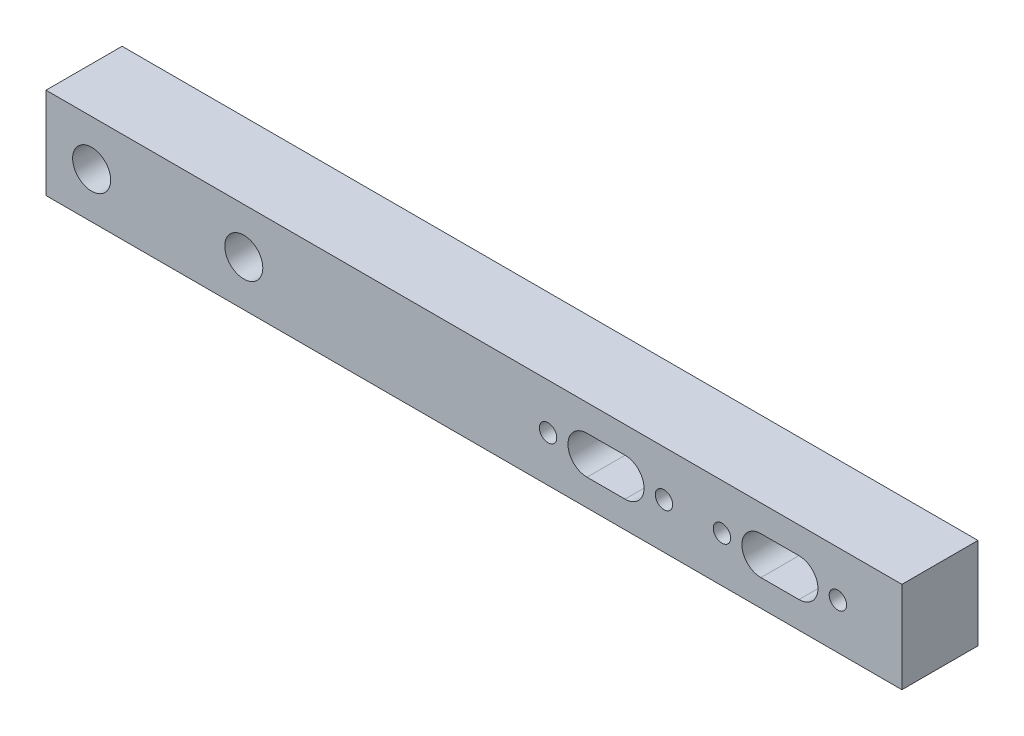
ISO-10303-21;
HEADER;
FILE_DESCRIPTION(('STEP AP214'),'2;1');
FILE_NAME('part.step','',(''),(''),'','','');
FILE_SCHEMA(('AUTOMOTIVE_DESIGN { 1 0 10303 214 1 1 1 1 }'));
ENDSEC;
DATA;
#1=APPLICATION_CONTEXT('core data for automotive mechanical design processes');
#2=APPLICATION_PROTOCOL_DEFINITION('international standard','automotive_design',2000,#1);
#3=PRODUCT_CONTEXT('',#1,'mechanical');
#4=PRODUCT('Part','Part','',(#3));
#5=PRODUCT_RELATED_PRODUCT_CATEGORY('part','',(#4));
#6=PRODUCT_DEFINITION_FORMATION('','',#4);
#7=PRODUCT_DEFINITION_CONTEXT('part definition',#1,'design');
#8=PRODUCT_DEFINITION('design','',#6,#7);
#9=PRODUCT_DEFINITION_SHAPE('','',#8);
#10=(LENGTH_UNIT() NAMED_UNIT(*) SI_UNIT(.MILLI.,.METRE.));
#11=(NAMED_UNIT(*) PLANE_ANGLE_UNIT() SI_UNIT($,.RADIAN.));
#12=(NAMED_UNIT(*) SI_UNIT($,.STERADIAN.) SOLID_ANGLE_UNIT());
#13=UNCERTAINTY_MEASURE_WITH_UNIT(LENGTH_MEASURE(1.E-05),#10,'distance_accuracy_value','');
#14=(GEOMETRIC_REPRESENTATION_CONTEXT(3) GLOBAL_UNCERTAINTY_ASSIGNED_CONTEXT((#13)) GLOBAL_UNIT_ASSIGNED_CONTEXT((#10,
#11,#12)) REPRESENTATION_CONTEXT('',''));
#15=CARTESIAN_POINT('',(0.,0.,0.));
#16=DIRECTION('',(0.,0.,1.));
#17=DIRECTION('',(1.,0.,0.));
#18=AXIS2_PLACEMENT_3D('',#15,#16,#17);
#19=CARTESIAN_POINT('',(0.,0.,10.));
#20=DIRECTION('',(0.,0.,1.));
#21=DIRECTION('',(1.,0.,0.));
#22=AXIS2_PLACEMENT_3D('',#19,#20,#21);
#23=PLANE('',#22);
#24=CARTESIAN_POINT('',(-66.6827911345728,73.1963244597104,10.));
#25=DIRECTION('',(0.,0.,1.));
#26=DIRECTION('',(1.,0.,0.));
#27=AXIS2_PLACEMENT_3D('',#24,#25,#26);
#28=CIRCLE('',#27,1.14299999999999);
#29=CARTESIAN_POINT('',(-65.5397911345728,73.1963244597104,10.));
#30=VERTEX_POINT('',#29);
#31=EDGE_CURVE('E195',#30,#30,#28,.T.);
#32=ORIENTED_EDGE('',*,*,#31,.F.);
#33=EDGE_LOOP('',(#32));
#34=FACE_BOUND('',#33,.T.);
#35=CARTESIAN_POINT('',(-89.5427911345728,73.1963244597104,10.));
#36=DIRECTION('',(0.,0.,1.));
#37=DIRECTION('',(1.,0.,0.));
#38=AXIS2_PLACEMENT_3D('',#35,#36,#37);
#39=CIRCLE('',#38,1.14299999999999);
#40=CARTESIAN_POINT('',(-88.3997911345728,73.1963244597104,10.));
#41=VERTEX_POINT('',#40);
#42=EDGE_CURVE('E207',#41,#41,#39,.T.);
#43=ORIENTED_EDGE('',*,*,#42,.F.);
#44=EDGE_LOOP('',(#43));
#45=FACE_BOUND('',#44,.T.);
#46=CARTESIAN_POINT('',(-149.542791134573,73.1963244597104,10.));
#47=DIRECTION('',(0.,0.,1.));
#48=DIRECTION('',(1.,0.,0.));
#49=AXIS2_PLACEMENT_3D('',#46,#47,#48);
#50=CIRCLE('',#49,2.5);
#51=CARTESIAN_POINT('',(-147.042791134573,73.1963244597104,10.));
#52=VERTEX_POINT('',#51);
#53=EDGE_CURVE('E219',#52,#52,#50,.T.);
#54=ORIENTED_EDGE('',*,*,#53,.F.);
#55=EDGE_LOOP('',(#54));
#56=FACE_BOUND('',#55,.T.);
#57=DIRECTION('',(0.,-1.,0.));
#58=VECTOR('',#57,1.);
#59=CARTESIAN_POINT('',(-155.542791134573,79.1963244597104,10.));
#60=LINE('',#59,#58);
#61=CARTESIAN_POINT('',(-155.542791134573,79.1963244597104,10.));
#62=VERTEX_POINT('',#61);
#63=CARTESIAN_POINT('',(-155.542791134573,67.1963244597104,10.));
#64=VERTEX_POINT('',#63);
#65=EDGE_CURVE('E225',#62,#64,#60,.T.);
#66=ORIENTED_EDGE('',*,*,#65,.T.);
#67=DIRECTION('',(1.,0.,0.));
#68=VECTOR('',#67,1.);
#69=CARTESIAN_POINT('',(-155.542791134573,67.1963244597104,10.));
#70=LINE('',#69,#68);
#71=CARTESIAN_POINT('',(-43.0227047758469,67.1963244597104,10.));
#72=VERTEX_POINT('',#71);
#73=EDGE_CURVE('E228',#64,#72,#70,.T.);
#74=ORIENTED_EDGE('',*,*,#73,.T.);
#75=DIRECTION('',(0.,1.,0.));
#76=VECTOR('',#75,1.);
#77=CARTESIAN_POINT('',(-43.0227047758469,79.1963244597104,10.));
#78=LINE('',#77,#76);
#79=CARTESIAN_POINT('',(-43.0227047758469,79.1963244597104,10.));
#80=VERTEX_POINT('',#79);
#81=EDGE_CURVE('E231',#72,#80,#78,.T.);
#82=ORIENTED_EDGE('',*,*,#81,.T.);
#83=DIRECTION('',(-1.,0.,0.));
#84=VECTOR('',#83,1.);
#85=CARTESIAN_POINT('',(-155.542791134573,79.1963244597104,10.));
#86=LINE('',#85,#84);
#87=EDGE_CURVE('E233',#80,#62,#86,.T.);
#88=ORIENTED_EDGE('',*,*,#87,.T.);
#89=EDGE_LOOP('',(#66,#74,#82,#88));
#90=FACE_BOUND('',#89,.T.);
#91=CARTESIAN_POINT('',(-129.542791134573,73.1963244597104,10.));
#92=DIRECTION('',(0.,0.,1.));
#93=DIRECTION('',(1.,0.,0.));
#94=AXIS2_PLACEMENT_3D('',#91,#92,#93);
#95=CIRCLE('',#94,2.5);
#96=CARTESIAN_POINT('',(-127.042791134573,73.1963244597104,10.));
#97=VERTEX_POINT('',#96);
#98=EDGE_CURVE('E213',#97,#97,#95,.T.);
#99=ORIENTED_EDGE('',*,*,#98,.F.);
#100=EDGE_LOOP('',(#99));
#101=FACE_BOUND('',#100,.T.);
#102=CARTESIAN_POINT('',(-74.3027911345728,73.1963244597104,10.));
#103=DIRECTION('',(0.,0.,1.));
#104=DIRECTION('',(1.,0.,0.));
#105=AXIS2_PLACEMENT_3D('',#102,#103,#104);
#106=CIRCLE('',#105,1.14299999999999);
#107=CARTESIAN_POINT('',(-73.1597911345728,73.1963244597104,10.));
#108=VERTEX_POINT('',#107);
#109=EDGE_CURVE('E201',#108,#108,#106,.T.);
#110=ORIENTED_EDGE('',*,*,#109,.F.);
#111=EDGE_LOOP('',(#110));
#112=FACE_BOUND('',#111,.T.);
#113=CARTESIAN_POINT('',(-51.4427911345728,73.1963244597104,10.));
#114=DIRECTION('',(0.,0.,1.));
#115=DIRECTION('',(1.,0.,0.));
#116=AXIS2_PLACEMENT_3D('',#113,#114,#115);
#117=CIRCLE('',#116,1.14299999999999);
#118=CARTESIAN_POINT('',(-50.2997911345728,73.1963244597104,10.));
#119=VERTEX_POINT('',#118);
#120=EDGE_CURVE('E189',#119,#119,#117,.T.);
#121=ORIENTED_EDGE('',*,*,#120,.F.);
#122=EDGE_LOOP('',(#121));
#123=FACE_BOUND('',#122,.T.);
#124=DIRECTION('',(1.,0.,0.));
#125=VECTOR('',#124,1.);
#126=CARTESIAN_POINT('',(-84.4227911345728,70.6963244597104,10.));
#127=LINE('',#126,#125);
#128=CARTESIAN_POINT('',(-84.4227911345728,70.6963244597104,10.));
#129=VERTEX_POINT('',#128);
#130=CARTESIAN_POINT('',(-79.4227911345728,70.6963244597104,10.));
#131=VERTEX_POINT('',#130);
#132=EDGE_CURVE('E160',#129,#131,#127,.T.);
#133=ORIENTED_EDGE('',*,*,#132,.F.);
#134=CARTESIAN_POINT('',(-84.4227911345728,73.1963244597104,10.));
#135=DIRECTION('',(0.,0.,1.));
#136=DIRECTION('',(1.,0.,0.));
#137=AXIS2_PLACEMENT_3D('',#134,#135,#136);
#138=CIRCLE('',#137,2.5);
#139=CARTESIAN_POINT('',(-84.4227911345728,75.6963244597104,10.));
#140=VERTEX_POINT('',#139);
#141=EDGE_CURVE('E158',#140,#129,#138,.T.);
#142=ORIENTED_EDGE('',*,*,#141,.F.);
#143=DIRECTION('',(-1.,0.,0.));
#144=VECTOR('',#143,1.);
#145=CARTESIAN_POINT('',(-84.4227911345728,75.6963244597104,10.));
#146=LINE('',#145,#144);
#147=CARTESIAN_POINT('',(-79.4227911345728,75.6963244597104,10.));
#148=VERTEX_POINT('',#147);
#149=EDGE_CURVE('E166',#148,#140,#146,.T.);
#150=ORIENTED_EDGE('',*,*,#149,.F.);
#151=CARTESIAN_POINT('',(-79.4227911345728,73.1963244597104,10.));
#152=DIRECTION('',(0.,0.,1.));
#153=DIRECTION('',(1.,0.,0.));
#154=AXIS2_PLACEMENT_3D('',#151,#152,#153);
#155=CIRCLE('',#154,2.5);
#156=EDGE_CURVE('E163',#131,#148,#155,.T.);
#157=ORIENTED_EDGE('',*,*,#156,.F.);
#158=EDGE_LOOP('',(#133,#142,#150,#157));
#159=FACE_BOUND('',#158,.T.);
#160=DIRECTION('',(1.,0.,0.));
#161=VECTOR('',#160,1.);
#162=CARTESIAN_POINT('',(-61.5627911345728,70.6963244597104,10.));
#163=LINE('',#162,#161);
#164=CARTESIAN_POINT('',(-61.5627911345728,70.6963244597104,10.));
#165=VERTEX_POINT('',#164);
#166=CARTESIAN_POINT('',(-56.5627911345728,70.6963244597104,10.));
#167=VERTEX_POINT('',#166);
#168=EDGE_CURVE('E130',#165,#167,#163,.T.);
#169=ORIENTED_EDGE('',*,*,#168,.F.);
#170=CARTESIAN_POINT('',(-61.5627911345728,73.1963244597104,10.));
#171=DIRECTION('',(0.,0.,1.));
#172=DIRECTION('',(1.,0.,0.));
#173=AXIS2_PLACEMENT_3D('',#170,#171,#172);
#174=CIRCLE('',#173,2.5);
#175=CARTESIAN_POINT('',(-61.5627911345728,75.6963244597104,10.));
#176=VERTEX_POINT('',#175);
#177=EDGE_CURVE('E122',#176,#165,#174,.T.);
#178=ORIENTED_EDGE('',*,*,#177,.F.);
#179=DIRECTION('',(-1.,0.,0.));
#180=VECTOR('',#179,1.);
#181=CARTESIAN_POINT('',(-61.5627911345728,75.6963244597104,10.));
#182=LINE('',#181,#180);
#183=CARTESIAN_POINT('',(-56.5627911345728,75.6963244597104,10.));
#184=VERTEX_POINT('',#183);
#185=EDGE_CURVE('E144',#184,#176,#182,.T.);
#186=ORIENTED_EDGE('',*,*,#185,.F.);
#187=CARTESIAN_POINT('',(-56.5627911345728,73.1963244597104,10.));
#188=DIRECTION('',(0.,0.,1.));
#189=DIRECTION('',(1.,0.,0.));
#190=AXIS2_PLACEMENT_3D('',#187,#188,#189);
#191=CIRCLE('',#190,2.5);
#192=EDGE_CURVE('E142',#167,#184,#191,.T.);
#193=ORIENTED_EDGE('',*,*,#192,.F.);
#194=EDGE_LOOP('',(#169,#178,#186,#193));
#195=FACE_BOUND('',#194,.T.);
#196=ADVANCED_FACE('F33',(#34,#45,#56,#90,#101,#112,#123,#159,#195),#23,.T.);
#197=CARTESIAN_POINT('',(0.,0.,0.));
#198=DIRECTION('',(0.,0.,1.));
#199=DIRECTION('',(1.,0.,0.));
#200=AXIS2_PLACEMENT_3D('',#197,#198,#199);
#201=PLANE('',#200);
#202=CARTESIAN_POINT('',(-84.4227911345728,73.1963244597104,0.));
#203=DIRECTION('',(0.,0.,1.));
#204=DIRECTION('',(1.,0.,0.));
#205=AXIS2_PLACEMENT_3D('',#202,#203,#204);
#206=CIRCLE('',#205,2.5);
#207=CARTESIAN_POINT('',(-84.4227911345728,75.6963244597104,0.));
#208=VERTEX_POINT('',#207);
#209=CARTESIAN_POINT('',(-84.4227911345728,70.6963244597104,0.));
#210=VERTEX_POINT('',#209);
#211=EDGE_CURVE('E138',#208,#210,#206,.T.);
#212=ORIENTED_EDGE('',*,*,#211,.T.);
#213=DIRECTION('',(1.,0.,0.));
#214=VECTOR('',#213,1.);
#215=CARTESIAN_POINT('',(-84.4227911345728,70.6963244597104,0.));
#216=LINE('',#215,#214);
#217=CARTESIAN_POINT('',(-79.4227911345728,70.6963244597104,0.));
#218=VERTEX_POINT('',#217);
#219=EDGE_CURVE('E171',#210,#218,#216,.T.);
#220=ORIENTED_EDGE('',*,*,#219,.T.);
#221=CARTESIAN_POINT('',(-79.4227911345728,73.1963244597104,0.));
#222=DIRECTION('',(0.,0.,1.));
#223=DIRECTION('',(1.,0.,0.));
#224=AXIS2_PLACEMENT_3D('',#221,#222,#223);
#225=CIRCLE('',#224,2.5);
#226=CARTESIAN_POINT('',(-79.4227911345728,75.6963244597104,0.));
#227=VERTEX_POINT('',#226);
#228=EDGE_CURVE('E174',#218,#227,#225,.T.);
#229=ORIENTED_EDGE('',*,*,#228,.T.);
#230=DIRECTION('',(-1.,0.,0.));
#231=VECTOR('',#230,1.);
#232=CARTESIAN_POINT('',(-84.4227911345728,75.6963244597104,0.));
#233=LINE('',#232,#231);
#234=EDGE_CURVE('E161',#227,#208,#233,.T.);
#235=ORIENTED_EDGE('',*,*,#234,.T.);
#236=EDGE_LOOP('',(#212,#220,#229,#235));
#237=FACE_BOUND('',#236,.T.);
#238=DIRECTION('',(0.,-1.,0.));
#239=VECTOR('',#238,1.);
#240=CARTESIAN_POINT('',(-155.542791134573,79.1963244597104,0.));
#241=LINE('',#240,#239);
#242=CARTESIAN_POINT('',(-155.542791134573,79.1963244597104,0.));
#243=VERTEX_POINT('',#242);
#244=CARTESIAN_POINT('',(-155.542791134573,67.1963244597104,0.));
#245=VERTEX_POINT('',#244);
#246=EDGE_CURVE('E222',#243,#245,#241,.T.);
#247=ORIENTED_EDGE('',*,*,#246,.F.);
#248=DIRECTION('',(-1.,0.,0.));
#249=VECTOR('',#248,1.);
#250=CARTESIAN_POINT('',(-155.542791134573,79.1963244597104,0.));
#251=LINE('',#250,#249);
#252=CARTESIAN_POINT('',(-43.0227047758469,79.1963244597104,0.));
#253=VERTEX_POINT('',#252);
#254=EDGE_CURVE('E229',#253,#243,#251,.T.);
#255=ORIENTED_EDGE('',*,*,#254,.F.);
#256=DIRECTION('',(0.,1.,0.));
#257=VECTOR('',#256,1.);
#258=CARTESIAN_POINT('',(-43.0227047758469,79.1963244597104,0.));
#259=LINE('',#258,#257);
#260=CARTESIAN_POINT('',(-43.0227047758469,67.1963244597104,0.));
#261=VERTEX_POINT('',#260);
#262=EDGE_CURVE('E240',#261,#253,#259,.T.);
#263=ORIENTED_EDGE('',*,*,#262,.F.);
#264=DIRECTION('',(1.,0.,0.));
#265=VECTOR('',#264,1.);
#266=CARTESIAN_POINT('',(-155.542791134573,67.1963244597104,0.));
#267=LINE('',#266,#265);
#268=EDGE_CURVE('E238',#245,#261,#267,.T.);
#269=ORIENTED_EDGE('',*,*,#268,.F.);
#270=EDGE_LOOP('',(#247,#255,#263,#269));
#271=FACE_BOUND('',#270,.T.);
#272=CARTESIAN_POINT('',(-149.542791134573,73.1963244597104,0.));
#273=DIRECTION('',(0.,0.,1.));
#274=DIRECTION('',(1.,0.,0.));
#275=AXIS2_PLACEMENT_3D('',#272,#273,#274);
#276=CIRCLE('',#275,2.5);
#277=CARTESIAN_POINT('',(-147.042791134573,73.1963244597104,0.));
#278=VERTEX_POINT('',#277);
#279=EDGE_CURVE('E216',#278,#278,#276,.T.);
#280=ORIENTED_EDGE('',*,*,#279,.T.);
#281=EDGE_LOOP('',(#280));
#282=FACE_BOUND('',#281,.T.);
#283=CARTESIAN_POINT('',(-129.542791134573,73.1963244597104,0.));
#284=DIRECTION('',(0.,0.,1.));
#285=DIRECTION('',(1.,0.,0.));
#286=AXIS2_PLACEMENT_3D('',#283,#284,#285);
#287=CIRCLE('',#286,2.5);
#288=CARTESIAN_POINT('',(-127.042791134573,73.1963244597104,0.));
#289=VERTEX_POINT('',#288);
#290=EDGE_CURVE('E210',#289,#289,#287,.T.);
#291=ORIENTED_EDGE('',*,*,#290,.T.);
#292=EDGE_LOOP('',(#291));
#293=FACE_BOUND('',#292,.T.);
#294=CARTESIAN_POINT('',(-89.5427911345728,73.1963244597104,0.));
#295=DIRECTION('',(0.,0.,1.));
#296=DIRECTION('',(1.,0.,0.));
#297=AXIS2_PLACEMENT_3D('',#294,#295,#296);
#298=CIRCLE('',#297,1.14299999999999);
#299=CARTESIAN_POINT('',(-88.3997911345728,73.1963244597104,0.));
#300=VERTEX_POINT('',#299);
#301=EDGE_CURVE('E204',#300,#300,#298,.T.);
#302=ORIENTED_EDGE('',*,*,#301,.T.);
#303=EDGE_LOOP('',(#302));
#304=FACE_BOUND('',#303,.T.);
#305=CARTESIAN_POINT('',(-74.3027911345728,73.1963244597104,0.));
#306=DIRECTION('',(0.,0.,1.));
#307=DIRECTION('',(1.,0.,0.));
#308=AXIS2_PLACEMENT_3D('',#305,#306,#307);
#309=CIRCLE('',#308,1.14299999999999);
#310=CARTESIAN_POINT('',(-73.1597911345728,73.1963244597104,0.));
#311=VERTEX_POINT('',#310);
#312=EDGE_CURVE('E198',#311,#311,#309,.T.);
#313=ORIENTED_EDGE('',*,*,#312,.T.);
#314=EDGE_LOOP('',(#313));
#315=FACE_BOUND('',#314,.T.);
#316=CARTESIAN_POINT('',(-66.6827911345728,73.1963244597104,0.));
#317=DIRECTION('',(0.,0.,1.));
#318=DIRECTION('',(1.,0.,0.));
#319=AXIS2_PLACEMENT_3D('',#316,#317,#318);
#320=CIRCLE('',#319,1.14299999999999);
#321=CARTESIAN_POINT('',(-65.5397911345728,73.1963244597104,0.));
#322=VERTEX_POINT('',#321);
#323=EDGE_CURVE('E192',#322,#322,#320,.T.);
#324=ORIENTED_EDGE('',*,*,#323,.T.);
#325=EDGE_LOOP('',(#324));
#326=FACE_BOUND('',#325,.T.);
#327=CARTESIAN_POINT('',(-51.4427911345728,73.1963244597104,0.));
#328=DIRECTION('',(0.,0.,1.));
#329=DIRECTION('',(1.,0.,0.));
#330=AXIS2_PLACEMENT_3D('',#327,#328,#329);
#331=CIRCLE('',#330,1.14299999999999);
#332=CARTESIAN_POINT('',(-50.2997911345728,73.1963244597104,0.));
#333=VERTEX_POINT('',#332);
#334=EDGE_CURVE('E188',#333,#333,#331,.T.);
#335=ORIENTED_EDGE('',*,*,#334,.T.);
#336=EDGE_LOOP('',(#335));
#337=FACE_BOUND('',#336,.T.);
#338=CARTESIAN_POINT('',(-61.5627911345728,73.1963244597104,0.));
#339=DIRECTION('',(0.,0.,1.));
#340=DIRECTION('',(1.,0.,0.));
#341=AXIS2_PLACEMENT_3D('',#338,#339,#340);
#342=CIRCLE('',#341,2.5);
#343=CARTESIAN_POINT('',(-61.5627911345728,75.6963244597104,0.));
#344=VERTEX_POINT('',#343);
#345=CARTESIAN_POINT('',(-61.5627911345728,70.6963244597104,0.));
#346=VERTEX_POINT('',#345);
#347=EDGE_CURVE('E56',#344,#346,#342,.T.);
#348=ORIENTED_EDGE('',*,*,#347,.T.);
#349=DIRECTION('',(1.,0.,0.));
#350=VECTOR('',#349,1.);
#351=CARTESIAN_POINT('',(-61.5627911345728,70.6963244597104,0.));
#352=LINE('',#351,#350);
#353=CARTESIAN_POINT('',(-56.5627911345728,70.6963244597104,0.));
#354=VERTEX_POINT('',#353);
#355=EDGE_CURVE('E137',#346,#354,#352,.T.);
#356=ORIENTED_EDGE('',*,*,#355,.T.);
#357=CARTESIAN_POINT('',(-56.5627911345728,73.1963244597104,0.));
#358=DIRECTION('',(0.,0.,1.));
#359=DIRECTION('',(1.,0.,0.));
#360=AXIS2_PLACEMENT_3D('',#357,#358,#359);
#361=CIRCLE('',#360,2.5);
#362=CARTESIAN_POINT('',(-56.5627911345728,75.6963244597104,0.));
#363=VERTEX_POINT('',#362);
#364=EDGE_CURVE('E150',#354,#363,#361,.T.);
#365=ORIENTED_EDGE('',*,*,#364,.T.);
#366=DIRECTION('',(-1.,0.,0.));
#367=VECTOR('',#366,1.);
#368=CARTESIAN_POINT('',(-61.5627911345728,75.6963244597104,0.));
#369=LINE('',#368,#367);
#370=EDGE_CURVE('E131',#363,#344,#369,.T.);
#371=ORIENTED_EDGE('',*,*,#370,.T.);
#372=EDGE_LOOP('',(#348,#356,#365,#371));
#373=FACE_BOUND('',#372,.T.);
#374=ADVANCED_FACE('F258',(#237,#271,#282,#293,#304,#315,#326,#337,#373),#201,.F.);
#375=CARTESIAN_POINT('',(-155.542791134573,79.1963244597104,10.));
#376=DIRECTION('',(1.,0.,0.));
#377=DIRECTION('',(0.,0.,-1.));
#378=AXIS2_PLACEMENT_3D('',#375,#376,#377);
#379=PLANE('',#378);
#380=ORIENTED_EDGE('',*,*,#246,.T.);
#381=DIRECTION('',(0.,0.,-1.));
#382=VECTOR('',#381,1.);
#383=CARTESIAN_POINT('',(-155.542791134573,67.1963244597104,10.));
#384=LINE('',#383,#382);
#385=EDGE_CURVE('E11',#64,#245,#384,.T.);
#386=ORIENTED_EDGE('',*,*,#385,.F.);
#387=ORIENTED_EDGE('',*,*,#65,.F.);
#388=DIRECTION('',(0.,0.,-1.));
#389=VECTOR('',#388,1.);
#390=CARTESIAN_POINT('',(-155.542791134573,79.1963244597104,10.));
#391=LINE('',#390,#389);
#392=EDGE_CURVE('E235',#62,#243,#391,.T.);
#393=ORIENTED_EDGE('',*,*,#392,.T.);
#394=EDGE_LOOP('',(#380,#386,#387,#393));
#395=FACE_BOUND('',#394,.T.);
#396=ADVANCED_FACE('F35',(#395),#379,.F.);
#397=CARTESIAN_POINT('',(-155.542791134573,67.1963244597104,10.));
#398=DIRECTION('',(0.,1.,0.));
#399=DIRECTION('',(0.,0.,1.));
#400=AXIS2_PLACEMENT_3D('',#397,#398,#399);
#401=PLANE('',#400);
#402=ORIENTED_EDGE('',*,*,#268,.T.);
#403=DIRECTION('',(0.,0.,-1.));
#404=VECTOR('',#403,1.);
#405=CARTESIAN_POINT('',(-43.0227047758469,67.1963244597104,10.));
#406=LINE('',#405,#404);
#407=EDGE_CURVE('E41',#72,#261,#406,.T.);
#408=ORIENTED_EDGE('',*,*,#407,.F.);
#409=ORIENTED_EDGE('',*,*,#73,.F.);
#410=ORIENTED_EDGE('',*,*,#385,.T.);
#411=EDGE_LOOP('',(#402,#408,#409,#410));
#412=FACE_BOUND('',#411,.T.);
#413=ADVANCED_FACE('F269',(#412),#401,.F.);
#414=CARTESIAN_POINT('',(-43.0227047758469,79.1963244597104,10.));
#415=DIRECTION('',(-1.,0.,0.));
#416=DIRECTION('',(0.,0.,1.));
#417=AXIS2_PLACEMENT_3D('',#414,#415,#416);
#418=PLANE('',#417);
#419=ORIENTED_EDGE('',*,*,#262,.T.);
#420=DIRECTION('',(0.,0.,-1.));
#421=VECTOR('',#420,1.);
#422=CARTESIAN_POINT('',(-43.0227047758469,79.1963244597104,10.));
#423=LINE('',#422,#421);
#424=EDGE_CURVE('E245',#80,#253,#423,.T.);
#425=ORIENTED_EDGE('',*,*,#424,.F.);
#426=ORIENTED_EDGE('',*,*,#81,.F.);
#427=ORIENTED_EDGE('',*,*,#407,.T.);
#428=EDGE_LOOP('',(#419,#425,#426,#427));
#429=FACE_BOUND('',#428,.T.);
#430=ADVANCED_FACE('F252',(#429),#418,.F.);
#431=CARTESIAN_POINT('',(-155.542791134573,79.1963244597104,10.));
#432=DIRECTION('',(0.,-1.,0.));
#433=DIRECTION('',(0.,0.,-1.));
#434=AXIS2_PLACEMENT_3D('',#431,#432,#433);
#435=PLANE('',#434);
#436=ORIENTED_EDGE('',*,*,#254,.T.);
#437=ORIENTED_EDGE('',*,*,#392,.F.);
#438=ORIENTED_EDGE('',*,*,#87,.F.);
#439=ORIENTED_EDGE('',*,*,#424,.T.);
#440=EDGE_LOOP('',(#436,#437,#438,#439));
#441=FACE_BOUND('',#440,.T.);
#442=ADVANCED_FACE('F262',(#441),#435,.F.);
#443=CARTESIAN_POINT('',(-149.542791134573,73.1963244597104,10.));
#444=DIRECTION('',(0.,0.,-1.));
#445=DIRECTION('',(-1.,0.,0.));
#446=AXIS2_PLACEMENT_3D('',#443,#444,#445);
#447=CYLINDRICAL_SURFACE('',#446,2.5);
#448=ORIENTED_EDGE('',*,*,#53,.T.);
#449=EDGE_LOOP('',(#448));
#450=FACE_BOUND('',#449,.T.);
#451=ORIENTED_EDGE('',*,*,#279,.F.);
#452=EDGE_LOOP('',(#451));
#453=FACE_BOUND('',#452,.T.);
#454=ADVANCED_FACE('F287',(#450,#453),#447,.F.);
#455=CARTESIAN_POINT('',(-129.542791134573,73.1963244597104,10.));
#456=DIRECTION('',(0.,0.,-1.));
#457=DIRECTION('',(-1.,0.,0.));
#458=AXIS2_PLACEMENT_3D('',#455,#456,#457);
#459=CYLINDRICAL_SURFACE('',#458,2.5);
#460=ORIENTED_EDGE('',*,*,#98,.T.);
#461=EDGE_LOOP('',(#460));
#462=FACE_BOUND('',#461,.T.);
#463=ORIENTED_EDGE('',*,*,#290,.F.);
#464=EDGE_LOOP('',(#463));
#465=FACE_BOUND('',#464,.T.);
#466=ADVANCED_FACE('F294',(#462,#465),#459,.F.);
#467=CARTESIAN_POINT('',(-89.5427911345728,73.1963244597104,10.));
#468=DIRECTION('',(0.,0.,-1.));
#469=DIRECTION('',(-1.,0.,0.));
#470=AXIS2_PLACEMENT_3D('',#467,#468,#469);
#471=CYLINDRICAL_SURFACE('',#470,1.14299999999999);
#472=ORIENTED_EDGE('',*,*,#42,.T.);
#473=EDGE_LOOP('',(#472));
#474=FACE_BOUND('',#473,.T.);
#475=ORIENTED_EDGE('',*,*,#301,.F.);
#476=EDGE_LOOP('',(#475));
#477=FACE_BOUND('',#476,.T.);
#478=ADVANCED_FACE('F299',(#474,#477),#471,.F.);
#479=CARTESIAN_POINT('',(-74.3027911345728,73.1963244597104,10.));
#480=DIRECTION('',(0.,0.,-1.));
#481=DIRECTION('',(-1.,0.,0.));
#482=AXIS2_PLACEMENT_3D('',#479,#480,#481);
#483=CYLINDRICAL_SURFACE('',#482,1.14299999999999);
#484=ORIENTED_EDGE('',*,*,#109,.T.);
#485=EDGE_LOOP('',(#484));
#486=FACE_BOUND('',#485,.T.);
#487=ORIENTED_EDGE('',*,*,#312,.F.);
#488=EDGE_LOOP('',(#487));
#489=FACE_BOUND('',#488,.T.);
#490=ADVANCED_FACE('F353',(#486,#489),#483,.F.);
#491=CARTESIAN_POINT('',(-66.6827911345728,73.1963244597104,10.));
#492=DIRECTION('',(0.,0.,-1.));
#493=DIRECTION('',(-1.,0.,0.));
#494=AXIS2_PLACEMENT_3D('',#491,#492,#493);
#495=CYLINDRICAL_SURFACE('',#494,1.14299999999999);
#496=ORIENTED_EDGE('',*,*,#31,.T.);
#497=EDGE_LOOP('',(#496));
#498=FACE_BOUND('',#497,.T.);
#499=ORIENTED_EDGE('',*,*,#323,.F.);
#500=EDGE_LOOP('',(#499));
#501=FACE_BOUND('',#500,.T.);
#502=ADVANCED_FACE('F349',(#498,#501),#495,.F.);
#503=CARTESIAN_POINT('',(-51.4427911345728,73.1963244597104,10.));
#504=DIRECTION('',(0.,0.,-1.));
#505=DIRECTION('',(-1.,0.,0.));
#506=AXIS2_PLACEMENT_3D('',#503,#504,#505);
#507=CYLINDRICAL_SURFACE('',#506,1.14299999999999);
#508=ORIENTED_EDGE('',*,*,#120,.T.);
#509=EDGE_LOOP('',(#508));
#510=FACE_BOUND('',#509,.T.);
#511=ORIENTED_EDGE('',*,*,#334,.F.);
#512=EDGE_LOOP('',(#511));
#513=FACE_BOUND('',#512,.T.);
#514=ADVANCED_FACE('F345',(#510,#513),#507,.F.);
#515=CARTESIAN_POINT('',(-84.4227911345728,73.1963244597104,10.));
#516=DIRECTION('',(0.,0.,-1.));
#517=DIRECTION('',(-1.,0.,0.));
#518=AXIS2_PLACEMENT_3D('',#515,#516,#517);
#519=CYLINDRICAL_SURFACE('',#518,2.5);
#520=ORIENTED_EDGE('',*,*,#211,.F.);
#521=DIRECTION('',(0.,0.,-1.));
#522=VECTOR('',#521,1.);
#523=CARTESIAN_POINT('',(-84.4227911345728,75.6963244597104,10.));
#524=LINE('',#523,#522);
#525=EDGE_CURVE('E168',#140,#208,#524,.T.);
#526=ORIENTED_EDGE('',*,*,#525,.F.);
#527=ORIENTED_EDGE('',*,*,#141,.T.);
#528=DIRECTION('',(0.,0.,-1.));
#529=VECTOR('',#528,1.);
#530=CARTESIAN_POINT('',(-84.4227911345728,70.6963244597104,10.));
#531=LINE('',#530,#529);
#532=EDGE_CURVE('E185',#129,#210,#531,.T.);
#533=ORIENTED_EDGE('',*,*,#532,.T.);
#534=EDGE_LOOP('',(#520,#526,#527,#533));
#535=FACE_BOUND('',#534,.T.);
#536=ADVANCED_FACE('F341',(#535),#519,.F.);
#537=CARTESIAN_POINT('',(-84.4227911345728,70.6963244597104,10.));
#538=DIRECTION('',(0.,1.,0.));
#539=DIRECTION('',(0.,0.,1.));
#540=AXIS2_PLACEMENT_3D('',#537,#538,#539);
#541=PLANE('',#540);
#542=ORIENTED_EDGE('',*,*,#219,.F.);
#543=ORIENTED_EDGE('',*,*,#532,.F.);
#544=ORIENTED_EDGE('',*,*,#132,.T.);
#545=DIRECTION('',(0.,0.,-1.));
#546=VECTOR('',#545,1.);
#547=CARTESIAN_POINT('',(-79.4227911345728,70.6963244597104,10.));
#548=LINE('',#547,#546);
#549=EDGE_CURVE('E183',#131,#218,#548,.T.);
#550=ORIENTED_EDGE('',*,*,#549,.T.);
#551=EDGE_LOOP('',(#542,#543,#544,#550));
#552=FACE_BOUND('',#551,.T.);
#553=ADVANCED_FACE('F337',(#552),#541,.T.);
#554=CARTESIAN_POINT('',(-79.4227911345728,73.1963244597104,10.));
#555=DIRECTION('',(0.,0.,-1.));
#556=DIRECTION('',(-1.,0.,0.));
#557=AXIS2_PLACEMENT_3D('',#554,#555,#556);
#558=CYLINDRICAL_SURFACE('',#557,2.5);
#559=ORIENTED_EDGE('',*,*,#228,.F.);
#560=ORIENTED_EDGE('',*,*,#549,.F.);
#561=ORIENTED_EDGE('',*,*,#156,.T.);
#562=DIRECTION('',(0.,0.,-1.));
#563=VECTOR('',#562,1.);
#564=CARTESIAN_POINT('',(-79.4227911345728,75.6963244597104,10.));
#565=LINE('',#564,#563);
#566=EDGE_CURVE('E181',#148,#227,#565,.T.);
#567=ORIENTED_EDGE('',*,*,#566,.T.);
#568=EDGE_LOOP('',(#559,#560,#561,#567));
#569=FACE_BOUND('',#568,.T.);
#570=ADVANCED_FACE('F333',(#569),#558,.F.);
#571=CARTESIAN_POINT('',(-84.4227911345728,75.6963244597104,10.));
#572=DIRECTION('',(0.,-1.,0.));
#573=DIRECTION('',(0.,0.,-1.));
#574=AXIS2_PLACEMENT_3D('',#571,#572,#573);
#575=PLANE('',#574);
#576=ORIENTED_EDGE('',*,*,#234,.F.);
#577=ORIENTED_EDGE('',*,*,#566,.F.);
#578=ORIENTED_EDGE('',*,*,#149,.T.);
#579=ORIENTED_EDGE('',*,*,#525,.T.);
#580=EDGE_LOOP('',(#576,#577,#578,#579));
#581=FACE_BOUND('',#580,.T.);
#582=ADVANCED_FACE('F330',(#581),#575,.T.);
#583=CARTESIAN_POINT('',(-61.5627911345728,73.1963244597104,10.));
#584=DIRECTION('',(0.,0.,-1.));
#585=DIRECTION('',(-1.,0.,0.));
#586=AXIS2_PLACEMENT_3D('',#583,#584,#585);
#587=CYLINDRICAL_SURFACE('',#586,2.5);
#588=ORIENTED_EDGE('',*,*,#347,.F.);
#589=DIRECTION('',(0.,0.,-1.));
#590=VECTOR('',#589,1.);
#591=CARTESIAN_POINT('',(-61.5627911345728,75.6963244597104,10.));
#592=LINE('',#591,#590);
#593=EDGE_CURVE('E126',#176,#344,#592,.T.);
#594=ORIENTED_EDGE('',*,*,#593,.F.);
#595=ORIENTED_EDGE('',*,*,#177,.T.);
#596=DIRECTION('',(0.,0.,-1.));
#597=VECTOR('',#596,1.);
#598=CARTESIAN_POINT('',(-61.5627911345728,70.6963244597104,10.));
#599=LINE('',#598,#597);
#600=EDGE_CURVE('E125',#165,#346,#599,.T.);
#601=ORIENTED_EDGE('',*,*,#600,.T.);
#602=EDGE_LOOP('',(#588,#594,#595,#601));
#603=FACE_BOUND('',#602,.T.);
#604=ADVANCED_FACE('F124',(#603),#587,.F.);
#605=CARTESIAN_POINT('',(-61.5627911345728,70.6963244597104,10.));
#606=DIRECTION('',(0.,1.,0.));
#607=DIRECTION('',(0.,0.,1.));
#608=AXIS2_PLACEMENT_3D('',#605,#606,#607);
#609=PLANE('',#608);
#610=ORIENTED_EDGE('',*,*,#355,.F.);
#611=ORIENTED_EDGE('',*,*,#600,.F.);
#612=ORIENTED_EDGE('',*,*,#168,.T.);
#613=DIRECTION('',(0.,0.,-1.));
#614=VECTOR('',#613,1.);
#615=CARTESIAN_POINT('',(-56.5627911345728,70.6963244597104,10.));
#616=LINE('',#615,#614);
#617=EDGE_CURVE('E139',#167,#354,#616,.T.);
#618=ORIENTED_EDGE('',*,*,#617,.T.);
#619=EDGE_LOOP('',(#610,#611,#612,#618));
#620=FACE_BOUND('',#619,.T.);
#621=ADVANCED_FACE('F134',(#620),#609,.T.);
#622=CARTESIAN_POINT('',(-56.5627911345728,73.1963244597104,10.));
#623=DIRECTION('',(0.,0.,-1.));
#624=DIRECTION('',(-1.,0.,0.));
#625=AXIS2_PLACEMENT_3D('',#622,#623,#624);
#626=CYLINDRICAL_SURFACE('',#625,2.5);
#627=ORIENTED_EDGE('',*,*,#364,.F.);
#628=ORIENTED_EDGE('',*,*,#617,.F.);
#629=ORIENTED_EDGE('',*,*,#192,.T.);
#630=DIRECTION('',(0.,0.,-1.));
#631=VECTOR('',#630,1.);
#632=CARTESIAN_POINT('',(-56.5627911345728,75.6963244597104,10.));
#633=LINE('',#632,#631);
#634=EDGE_CURVE('E48',#184,#363,#633,.T.);
#635=ORIENTED_EDGE('',*,*,#634,.T.);
#636=EDGE_LOOP('',(#627,#628,#629,#635));
#637=FACE_BOUND('',#636,.T.);
#638=ADVANCED_FACE('F318',(#637),#626,.F.);
#639=CARTESIAN_POINT('',(-61.5627911345728,75.6963244597104,10.));
#640=DIRECTION('',(0.,-1.,0.));
#641=DIRECTION('',(0.,0.,-1.));
#642=AXIS2_PLACEMENT_3D('',#639,#640,#641);
#643=PLANE('',#642);
#644=ORIENTED_EDGE('',*,*,#370,.F.);
#645=ORIENTED_EDGE('',*,*,#634,.F.);
#646=ORIENTED_EDGE('',*,*,#185,.T.);
#647=ORIENTED_EDGE('',*,*,#593,.T.);
#648=EDGE_LOOP('',(#644,#645,#646,#647));
#649=FACE_BOUND('',#648,.T.);
#650=ADVANCED_FACE('F316',(#649),#643,.T.);
#651=CLOSED_SHELL('',(#196,#374,#396,#413,#430,#442,#454,#466,#478,#490,#502,#514,#536,#553,
#570,#582,#604,#621,#638,#650));
#652=MANIFOLD_SOLID_BREP('B2',#651);
#653=ADVANCED_BREP_SHAPE_REPRESENTATION('',(#18,#652),#14);
#654=SHAPE_DEFINITION_REPRESENTATION(#9,#653);
ENDSEC;
END-ISO-10303-21;
